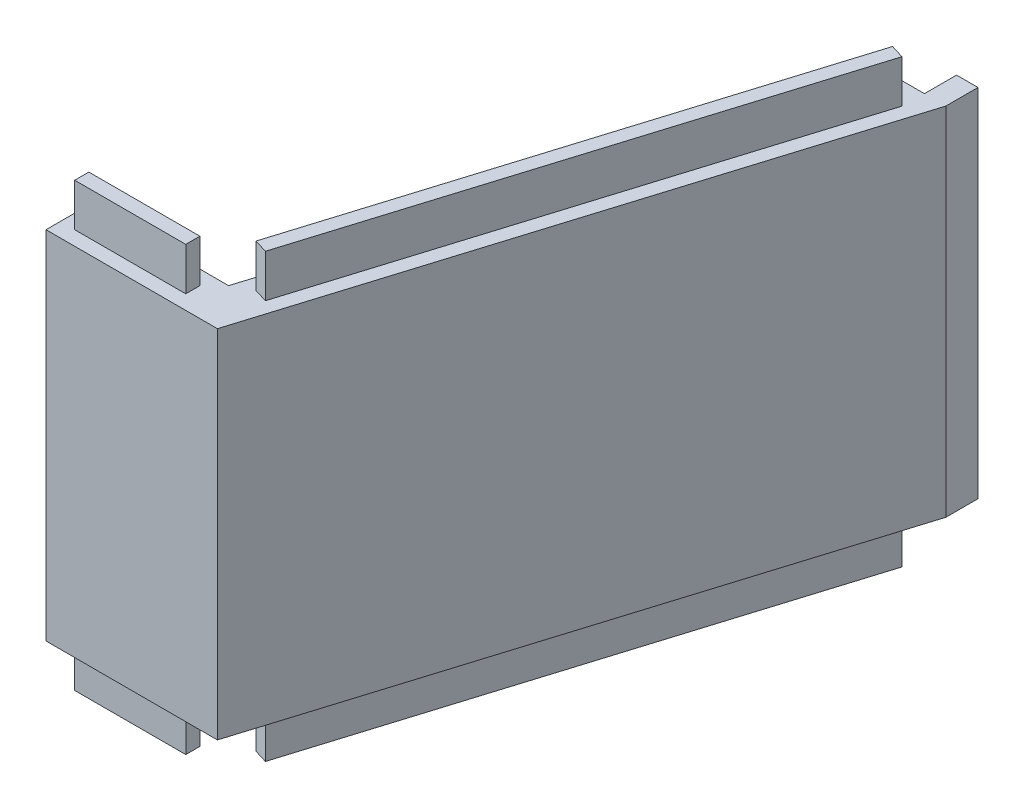
ISO-10303-21;
HEADER;
FILE_DESCRIPTION(('STEP AP214'),'2;1');
FILE_NAME('part.step','',(''),(''),'','','');
FILE_SCHEMA(('AUTOMOTIVE_DESIGN { 1 0 10303 214 1 1 1 1 }'));
ENDSEC;
DATA;
#1=APPLICATION_CONTEXT('core data for automotive mechanical design processes');
#2=APPLICATION_PROTOCOL_DEFINITION('international standard','automotive_design',2000,#1);
#3=PRODUCT_CONTEXT('',#1,'mechanical');
#4=PRODUCT('Part','Part','',(#3));
#5=PRODUCT_RELATED_PRODUCT_CATEGORY('part','',(#4));
#6=PRODUCT_DEFINITION_FORMATION('','',#4);
#7=PRODUCT_DEFINITION_CONTEXT('part definition',#1,'design');
#8=PRODUCT_DEFINITION('design','',#6,#7);
#9=PRODUCT_DEFINITION_SHAPE('','',#8);
#10=(LENGTH_UNIT() NAMED_UNIT(*) SI_UNIT(.MILLI.,.METRE.));
#11=(NAMED_UNIT(*) PLANE_ANGLE_UNIT() SI_UNIT($,.RADIAN.));
#12=(NAMED_UNIT(*) SI_UNIT($,.STERADIAN.) SOLID_ANGLE_UNIT());
#13=UNCERTAINTY_MEASURE_WITH_UNIT(LENGTH_MEASURE(1.E-05),#10,'distance_accuracy_value','');
#14=(GEOMETRIC_REPRESENTATION_CONTEXT(3) GLOBAL_UNCERTAINTY_ASSIGNED_CONTEXT((#13)) GLOBAL_UNIT_ASSIGNED_CONTEXT((#10,
#11,#12)) REPRESENTATION_CONTEXT('',''));
#15=CARTESIAN_POINT('',(0.,0.,0.));
#16=DIRECTION('',(0.,0.,1.));
#17=DIRECTION('',(1.,0.,0.));
#18=AXIS2_PLACEMENT_3D('',#15,#16,#17);
#19=CARTESIAN_POINT('',(0.,0.,0.));
#20=DIRECTION('',(0.,1.,0.));
#21=DIRECTION('',(0.,0.,1.));
#22=AXIS2_PLACEMENT_3D('',#19,#20,#21);
#23=PLANE('',#22);
#24=DIRECTION('',(0.,0.,1.));
#25=VECTOR('',#24,1.);
#26=CARTESIAN_POINT('',(-40.4238403091039,0.,0.));
#27=LINE('',#26,#25);
#28=CARTESIAN_POINT('',(-40.4238403091039,0.,140.920616058493));
#29=VERTEX_POINT('',#28);
#30=CARTESIAN_POINT('',(-40.4238403091039,0.,144.220616058493));
#31=VERTEX_POINT('',#30);
#32=EDGE_CURVE('E264',#29,#31,#27,.T.);
#33=ORIENTED_EDGE('',*,*,#32,.F.);
#34=DIRECTION('',(-1.,0.,0.));
#35=VECTOR('',#34,1.);
#36=CARTESIAN_POINT('',(0.,0.,140.920616058493));
#37=LINE('',#36,#35);
#38=CARTESIAN_POINT('',(-66.3380937639227,0.,140.920616058493));
#39=VERTEX_POINT('',#38);
#40=EDGE_CURVE('E252',#29,#39,#37,.T.);
#41=ORIENTED_EDGE('',*,*,#40,.T.);
#42=DIRECTION('',(0.,0.,1.));
#43=VECTOR('',#42,1.);
#44=CARTESIAN_POINT('',(-66.3380937639227,0.,0.));
#45=LINE('',#44,#43);
#46=CARTESIAN_POINT('',(-66.3380937639227,0.,144.220616058493));
#47=VERTEX_POINT('',#46);
#48=EDGE_CURVE('E272',#39,#47,#45,.T.);
#49=ORIENTED_EDGE('',*,*,#48,.T.);
#50=DIRECTION('',(-1.,0.,0.));
#51=VECTOR('',#50,1.);
#52=CARTESIAN_POINT('',(0.,0.,144.220616058493));
#53=LINE('',#52,#51);
#54=EDGE_CURVE('E268',#31,#47,#53,.T.);
#55=ORIENTED_EDGE('',*,*,#54,.F.);
#56=EDGE_LOOP('',(#33,#41,#49,#55));
#57=FACE_BOUND('',#56,.T.);
#58=DIRECTION('',(-0.294085848837523,0.,0.95577900872195));
#59=VECTOR('',#58,1.);
#60=CARTESIAN_POINT('',(4.80104336650318,0.,1.47724411277021));
#61=LINE('',#60,#59);
#62=CARTESIAN_POINT('',(-0.150763386026933,0.,17.5706160584931));
#63=VERTEX_POINT('',#62);
#64=CARTESIAN_POINT('',(-37.0738403091039,0.,137.570616058493));
#65=VERTEX_POINT('',#64);
#66=EDGE_CURVE('E336',#63,#65,#61,.T.);
#67=ORIENTED_EDGE('',*,*,#66,.F.);
#68=DIRECTION('',(-1.,0.,0.));
#69=VECTOR('',#68,1.);
#70=CARTESIAN_POINT('',(0.,0.,17.5706160584931));
#71=LINE('',#70,#69);
#72=CARTESIAN_POINT('',(5.31190623607724,0.,17.5706160584931));
#73=VERTEX_POINT('',#72);
#74=EDGE_CURVE('E380',#73,#63,#71,.T.);
#75=ORIENTED_EDGE('',*,*,#74,.F.);
#76=DIRECTION('',(0.,0.,1.));
#77=VECTOR('',#76,1.);
#78=CARTESIAN_POINT('',(5.31190623607724,0.,0.));
#79=LINE('',#78,#77);
#80=CARTESIAN_POINT('',(5.31190623607724,0.,10.0706160584931));
#81=VERTEX_POINT('',#80);
#82=EDGE_CURVE('E433',#81,#73,#79,.T.);
#83=ORIENTED_EDGE('',*,*,#82,.F.);
#84=DIRECTION('',(-1.,0.,0.));
#85=VECTOR('',#84,1.);
#86=CARTESIAN_POINT('',(0.,0.,10.0706160584931));
#87=LINE('',#86,#85);
#88=CARTESIAN_POINT('',(10.3119062360772,0.,10.0706160584931));
#89=VERTEX_POINT('',#88);
#90=EDGE_CURVE('E430',#89,#81,#87,.T.);
#91=ORIENTED_EDGE('',*,*,#90,.F.);
#92=DIRECTION('',(0.,0.,1.));
#93=VECTOR('',#92,1.);
#94=CARTESIAN_POINT('',(10.3119062360772,0.,0.));
#95=LINE('',#94,#93);
#96=CARTESIAN_POINT('',(10.3119062360772,0.,17.5706160584931));
#97=VERTEX_POINT('',#96);
#98=EDGE_CURVE('E426',#89,#97,#95,.T.);
#99=ORIENTED_EDGE('',*,*,#98,.T.);
#100=DIRECTION('',(-0.294085848837523,0.,0.95577900872195));
#101=VECTOR('',#100,1.);
#102=CARTESIAN_POINT('',(14.3588334537227,0.,4.41810260114544));
#103=LINE('',#102,#101);
#104=CARTESIAN_POINT('',(-29.6880937639228,0.,147.570616058493));
#105=VERTEX_POINT('',#104);
#106=EDGE_CURVE('E422',#97,#105,#103,.T.);
#107=ORIENTED_EDGE('',*,*,#106,.T.);
#108=DIRECTION('',(1.,0.,0.));
#109=VECTOR('',#108,1.);
#110=CARTESIAN_POINT('',(0.,0.,147.570616058493));
#111=LINE('',#110,#109);
#112=CARTESIAN_POINT('',(-69.6880937639227,0.,147.570616058493));
#113=VERTEX_POINT('',#112);
#114=EDGE_CURVE('E418',#113,#105,#111,.T.);
#115=ORIENTED_EDGE('',*,*,#114,.F.);
#116=DIRECTION('',(0.,0.,1.));
#117=VECTOR('',#116,1.);
#118=CARTESIAN_POINT('',(-69.6880937639227,0.,0.));
#119=LINE('',#118,#117);
#120=CARTESIAN_POINT('',(-69.6880937639227,0.,137.570616058493));
#121=VERTEX_POINT('',#120);
#122=EDGE_CURVE('E415',#121,#113,#119,.T.);
#123=ORIENTED_EDGE('',*,*,#122,.F.);
#124=DIRECTION('',(1.,0.,0.));
#125=VECTOR('',#124,1.);
#126=CARTESIAN_POINT('',(0.,0.,137.570616058493));
#127=LINE('',#126,#125);
#128=EDGE_CURVE('E411',#121,#65,#127,.T.);
#129=ORIENTED_EDGE('',*,*,#128,.T.);
#130=EDGE_LOOP('',(#67,#75,#83,#91,#99,#107,#115,#123,#129));
#131=FACE_BOUND('',#130,.T.);
#132=DIRECTION('',(0.294085848837523,0.,-0.95577900872195));
#133=VECTOR('',#132,1.);
#134=CARTESIAN_POINT('',(8.00290304572171,0.,2.46243170637591));
#135=LINE('',#134,#133);
#136=CARTESIAN_POINT('',(-32.8867930362796,0.,135.35394397288));
#137=VERTEX_POINT('',#136);
#138=CARTESIAN_POINT('',(2.06590869958589,0.,21.7576633313173));
#139=VERTEX_POINT('',#138);
#140=EDGE_CURVE('E62',#137,#139,#135,.T.);
#141=ORIENTED_EDGE('',*,*,#140,.F.);
#142=DIRECTION('',(0.955779008721952,0.,0.294085848837518));
#143=VECTOR('',#142,1.);
#144=CARTESIAN_POINT('',(-40.8896960820007,0.,132.891512266505));
#145=LINE('',#144,#143);
#146=CARTESIAN_POINT('',(-29.7327223074972,0.,136.324427274044));
#147=VERTEX_POINT('',#146);
#148=EDGE_CURVE('E67',#137,#147,#145,.T.);
#149=ORIENTED_EDGE('',*,*,#148,.T.);
#150=DIRECTION('',(0.294085848837523,0.,-0.95577900872195));
#151=VECTOR('',#150,1.);
#152=CARTESIAN_POINT('',(11.1569737745041,0.,3.43291500753974));
#153=LINE('',#152,#151);
#154=CARTESIAN_POINT('',(5.21997942836832,0.,22.7281466324811));
#155=VERTEX_POINT('',#154);
#156=EDGE_CURVE('E824',#147,#155,#153,.T.);
#157=ORIENTED_EDGE('',*,*,#156,.T.);
#158=DIRECTION('',(0.95577900872195,0.,0.294085848837523));
#159=VECTOR('',#158,1.);
#160=CARTESIAN_POINT('',(-5.93699434613581,0.,19.2952316249414));
#161=LINE('',#160,#159);
#162=EDGE_CURVE('E827',#139,#155,#161,.T.);
#163=ORIENTED_EDGE('',*,*,#162,.F.);
#164=EDGE_LOOP('',(#141,#149,#157,#163));
#165=FACE_BOUND('',#164,.T.);
#166=ADVANCED_FACE('F46',(#57,#131,#165),#23,.F.);
#167=CARTESIAN_POINT('',(0.,83.125,0.));
#168=DIRECTION('',(0.,1.,0.));
#169=DIRECTION('',(0.,0.,1.));
#170=AXIS2_PLACEMENT_3D('',#167,#168,#169);
#171=PLANE('',#170);
#172=DIRECTION('',(0.,0.,1.));
#173=VECTOR('',#172,1.);
#174=CARTESIAN_POINT('',(-40.4238403091039,83.125,0.));
#175=LINE('',#174,#173);
#176=CARTESIAN_POINT('',(-40.4238403091039,83.125,140.920616058493));
#177=VERTEX_POINT('',#176);
#178=CARTESIAN_POINT('',(-40.4238403091039,83.125,144.220616058493));
#179=VERTEX_POINT('',#178);
#180=EDGE_CURVE('E237',#177,#179,#175,.T.);
#181=ORIENTED_EDGE('',*,*,#180,.T.);
#182=DIRECTION('',(-1.,0.,0.));
#183=VECTOR('',#182,1.);
#184=CARTESIAN_POINT('',(0.,83.125,144.220616058493));
#185=LINE('',#184,#183);
#186=CARTESIAN_POINT('',(-66.3380937639227,83.125,144.220616058493));
#187=VERTEX_POINT('',#186);
#188=EDGE_CURVE('E342',#179,#187,#185,.T.);
#189=ORIENTED_EDGE('',*,*,#188,.T.);
#190=DIRECTION('',(0.,0.,1.));
#191=VECTOR('',#190,1.);
#192=CARTESIAN_POINT('',(-66.3380937639227,83.125,0.));
#193=LINE('',#192,#191);
#194=CARTESIAN_POINT('',(-66.3380937639227,83.125,140.920616058493));
#195=VERTEX_POINT('',#194);
#196=EDGE_CURVE('E356',#195,#187,#193,.T.);
#197=ORIENTED_EDGE('',*,*,#196,.F.);
#198=DIRECTION('',(-1.,0.,0.));
#199=VECTOR('',#198,1.);
#200=CARTESIAN_POINT('',(0.,83.125,140.920616058493));
#201=LINE('',#200,#199);
#202=EDGE_CURVE('E241',#177,#195,#201,.T.);
#203=ORIENTED_EDGE('',*,*,#202,.F.);
#204=EDGE_LOOP('',(#181,#189,#197,#203));
#205=FACE_BOUND('',#204,.T.);
#206=DIRECTION('',(-0.294085848837523,0.,0.95577900872195));
#207=VECTOR('',#206,1.);
#208=CARTESIAN_POINT('',(4.80104336650318,83.125,1.47724411277021));
#209=LINE('',#208,#207);
#210=CARTESIAN_POINT('',(-0.150763386026933,83.125,17.5706160584931));
#211=VERTEX_POINT('',#210);
#212=CARTESIAN_POINT('',(-37.0738403091039,83.125,137.570616058493));
#213=VERTEX_POINT('',#212);
#214=EDGE_CURVE('E376',#211,#213,#209,.T.);
#215=ORIENTED_EDGE('',*,*,#214,.T.);
#216=DIRECTION('',(1.,0.,0.));
#217=VECTOR('',#216,1.);
#218=CARTESIAN_POINT('',(0.,83.125,137.570616058493));
#219=LINE('',#218,#217);
#220=CARTESIAN_POINT('',(-69.6880937639227,83.125,137.570616058493));
#221=VERTEX_POINT('',#220);
#222=EDGE_CURVE('E379',#221,#213,#219,.T.);
#223=ORIENTED_EDGE('',*,*,#222,.F.);
#224=DIRECTION('',(0.,0.,1.));
#225=VECTOR('',#224,1.);
#226=CARTESIAN_POINT('',(-69.6880937639227,83.125,0.));
#227=LINE('',#226,#225);
#228=CARTESIAN_POINT('',(-69.6880937639227,83.125,147.570616058493));
#229=VERTEX_POINT('',#228);
#230=EDGE_CURVE('E384',#221,#229,#227,.T.);
#231=ORIENTED_EDGE('',*,*,#230,.T.);
#232=DIRECTION('',(1.,0.,0.));
#233=VECTOR('',#232,1.);
#234=CARTESIAN_POINT('',(0.,83.125,147.570616058493));
#235=LINE('',#234,#233);
#236=CARTESIAN_POINT('',(-29.6880937639228,83.125,147.570616058493));
#237=VERTEX_POINT('',#236);
#238=EDGE_CURVE('E387',#229,#237,#235,.T.);
#239=ORIENTED_EDGE('',*,*,#238,.T.);
#240=DIRECTION('',(-0.294085848837523,0.,0.95577900872195));
#241=VECTOR('',#240,1.);
#242=CARTESIAN_POINT('',(14.3588334537227,83.125,4.41810260114544));
#243=LINE('',#242,#241);
#244=CARTESIAN_POINT('',(10.3119062360772,83.125,17.5706160584931));
#245=VERTEX_POINT('',#244);
#246=EDGE_CURVE('E390',#245,#237,#243,.T.);
#247=ORIENTED_EDGE('',*,*,#246,.F.);
#248=DIRECTION('',(0.,0.,1.));
#249=VECTOR('',#248,1.);
#250=CARTESIAN_POINT('',(10.3119062360772,83.125,0.));
#251=LINE('',#250,#249);
#252=CARTESIAN_POINT('',(10.3119062360772,83.125,10.0706160584931));
#253=VERTEX_POINT('',#252);
#254=EDGE_CURVE('E394',#253,#245,#251,.T.);
#255=ORIENTED_EDGE('',*,*,#254,.F.);
#256=DIRECTION('',(-1.,0.,0.));
#257=VECTOR('',#256,1.);
#258=CARTESIAN_POINT('',(0.,83.125,10.0706160584931));
#259=LINE('',#258,#257);
#260=CARTESIAN_POINT('',(5.31190623607724,83.125,10.0706160584931));
#261=VERTEX_POINT('',#260);
#262=EDGE_CURVE('E398',#253,#261,#259,.T.);
#263=ORIENTED_EDGE('',*,*,#262,.T.);
#264=DIRECTION('',(0.,0.,1.));
#265=VECTOR('',#264,1.);
#266=CARTESIAN_POINT('',(5.31190623607724,83.125,0.));
#267=LINE('',#266,#265);
#268=CARTESIAN_POINT('',(5.31190623607724,83.125,17.5706160584931));
#269=VERTEX_POINT('',#268);
#270=EDGE_CURVE('E401',#261,#269,#267,.T.);
#271=ORIENTED_EDGE('',*,*,#270,.T.);
#272=DIRECTION('',(-1.,0.,0.));
#273=VECTOR('',#272,1.);
#274=CARTESIAN_POINT('',(0.,83.125,17.5706160584931));
#275=LINE('',#274,#273);
#276=EDGE_CURVE('E404',#269,#211,#275,.T.);
#277=ORIENTED_EDGE('',*,*,#276,.T.);
#278=EDGE_LOOP('',(#215,#223,#231,#239,#247,#255,#263,#271,#277));
#279=FACE_BOUND('',#278,.T.);
#280=DIRECTION('',(0.955779008721952,0.,0.294085848837518));
#281=VECTOR('',#280,1.);
#282=CARTESIAN_POINT('',(-40.8896960820007,83.125,132.891512266505));
#283=LINE('',#282,#281);
#284=CARTESIAN_POINT('',(-32.8867930362796,83.125,135.35394397288));
#285=VERTEX_POINT('',#284);
#286=CARTESIAN_POINT('',(-29.7327223074972,83.125,136.324427274044));
#287=VERTEX_POINT('',#286);
#288=EDGE_CURVE('E310',#285,#287,#283,.T.);
#289=ORIENTED_EDGE('',*,*,#288,.F.);
#290=DIRECTION('',(0.294085848837523,0.,-0.95577900872195));
#291=VECTOR('',#290,1.);
#292=CARTESIAN_POINT('',(8.00290304572171,83.125,2.46243170637591));
#293=LINE('',#292,#291);
#294=CARTESIAN_POINT('',(2.06590869958589,83.125,21.7576633313173));
#295=VERTEX_POINT('',#294);
#296=EDGE_CURVE('E307',#285,#295,#293,.T.);
#297=ORIENTED_EDGE('',*,*,#296,.T.);
#298=DIRECTION('',(0.95577900872195,0.,0.294085848837523));
#299=VECTOR('',#298,1.);
#300=CARTESIAN_POINT('',(-5.93699434613581,83.125,19.2952316249414));
#301=LINE('',#300,#299);
#302=CARTESIAN_POINT('',(5.21997942836832,83.125,22.7281466324811));
#303=VERTEX_POINT('',#302);
#304=EDGE_CURVE('E296',#295,#303,#301,.T.);
#305=ORIENTED_EDGE('',*,*,#304,.T.);
#306=DIRECTION('',(0.294085848837523,0.,-0.95577900872195));
#307=VECTOR('',#306,1.);
#308=CARTESIAN_POINT('',(11.1569737745041,83.125,3.43291500753974));
#309=LINE('',#308,#307);
#310=EDGE_CURVE('E315',#287,#303,#309,.T.);
#311=ORIENTED_EDGE('',*,*,#310,.F.);
#312=EDGE_LOOP('',(#289,#297,#305,#311));
#313=FACE_BOUND('',#312,.T.);
#314=ADVANCED_FACE('F505',(#205,#279,#313),#171,.T.);
#315=CARTESIAN_POINT('',(4.80104336650318,83.125,1.47724411277021));
#316=DIRECTION('',(0.95577900872195,0.,0.294085848837523));
#317=DIRECTION('',(0.294085848837523,0.,-0.95577900872195));
#318=AXIS2_PLACEMENT_3D('',#315,#316,#317);
#319=PLANE('',#318);
#320=ORIENTED_EDGE('',*,*,#66,.T.);
#321=DIRECTION('',(0.,-1.,0.));
#322=VECTOR('',#321,1.);
#323=CARTESIAN_POINT('',(-37.0738403091039,83.125,137.570616058493));
#324=LINE('',#323,#322);
#325=EDGE_CURVE('E11',#213,#65,#324,.T.);
#326=ORIENTED_EDGE('',*,*,#325,.F.);
#327=ORIENTED_EDGE('',*,*,#214,.F.);
#328=DIRECTION('',(0.,-1.,0.));
#329=VECTOR('',#328,1.);
#330=CARTESIAN_POINT('',(-0.150763386026933,83.125,17.5706160584931));
#331=LINE('',#330,#329);
#332=EDGE_CURVE('E407',#211,#63,#331,.T.);
#333=ORIENTED_EDGE('',*,*,#332,.T.);
#334=EDGE_LOOP('',(#320,#326,#327,#333));
#335=FACE_BOUND('',#334,.T.);
#336=ADVANCED_FACE('F48',(#335),#319,.F.);
#337=CARTESIAN_POINT('',(0.,83.125,137.570616058493));
#338=DIRECTION('',(0.,0.,-1.));
#339=DIRECTION('',(-1.,0.,0.));
#340=AXIS2_PLACEMENT_3D('',#337,#338,#339);
#341=PLANE('',#340);
#342=ORIENTED_EDGE('',*,*,#128,.F.);
#343=DIRECTION('',(0.,-1.,0.));
#344=VECTOR('',#343,1.);
#345=CARTESIAN_POINT('',(-69.6880937639227,83.125,137.570616058493));
#346=LINE('',#345,#344);
#347=EDGE_CURVE('E55',#221,#121,#346,.T.);
#348=ORIENTED_EDGE('',*,*,#347,.F.);
#349=ORIENTED_EDGE('',*,*,#222,.T.);
#350=ORIENTED_EDGE('',*,*,#325,.T.);
#351=EDGE_LOOP('',(#342,#348,#349,#350));
#352=FACE_BOUND('',#351,.T.);
#353=ADVANCED_FACE('F473',(#352),#341,.T.);
#354=CARTESIAN_POINT('',(-69.6880937639227,83.125,0.));
#355=DIRECTION('',(1.,0.,0.));
#356=DIRECTION('',(0.,0.,-1.));
#357=AXIS2_PLACEMENT_3D('',#354,#355,#356);
#358=PLANE('',#357);
#359=ORIENTED_EDGE('',*,*,#122,.T.);
#360=DIRECTION('',(0.,-1.,0.));
#361=VECTOR('',#360,1.);
#362=CARTESIAN_POINT('',(-69.6880937639227,83.125,147.570616058493));
#363=LINE('',#362,#361);
#364=EDGE_CURVE('E458',#229,#113,#363,.T.);
#365=ORIENTED_EDGE('',*,*,#364,.F.);
#366=ORIENTED_EDGE('',*,*,#230,.F.);
#367=ORIENTED_EDGE('',*,*,#347,.T.);
#368=EDGE_LOOP('',(#359,#365,#366,#367));
#369=FACE_BOUND('',#368,.T.);
#370=ADVANCED_FACE('F465',(#369),#358,.F.);
#371=CARTESIAN_POINT('',(0.,83.125,147.570616058493));
#372=DIRECTION('',(0.,0.,-1.));
#373=DIRECTION('',(-1.,0.,0.));
#374=AXIS2_PLACEMENT_3D('',#371,#372,#373);
#375=PLANE('',#374);
#376=ORIENTED_EDGE('',*,*,#114,.T.);
#377=DIRECTION('',(0.,-1.,0.));
#378=VECTOR('',#377,1.);
#379=CARTESIAN_POINT('',(-29.6880937639228,83.125,147.570616058493));
#380=LINE('',#379,#378);
#381=EDGE_CURVE('E455',#237,#105,#380,.T.);
#382=ORIENTED_EDGE('',*,*,#381,.F.);
#383=ORIENTED_EDGE('',*,*,#238,.F.);
#384=ORIENTED_EDGE('',*,*,#364,.T.);
#385=EDGE_LOOP('',(#376,#382,#383,#384));
#386=FACE_BOUND('',#385,.T.);
#387=ADVANCED_FACE('F503',(#386),#375,.F.);
#388=CARTESIAN_POINT('',(14.3588334537227,83.125,4.41810260114544));
#389=DIRECTION('',(0.95577900872195,0.,0.294085848837523));
#390=DIRECTION('',(0.294085848837523,0.,-0.95577900872195));
#391=AXIS2_PLACEMENT_3D('',#388,#389,#390);
#392=PLANE('',#391);
#393=ORIENTED_EDGE('',*,*,#106,.F.);
#394=DIRECTION('',(0.,-1.,0.));
#395=VECTOR('',#394,1.);
#396=CARTESIAN_POINT('',(10.3119062360772,83.125,17.5706160584931));
#397=LINE('',#396,#395);
#398=EDGE_CURVE('E452',#245,#97,#397,.T.);
#399=ORIENTED_EDGE('',*,*,#398,.F.);
#400=ORIENTED_EDGE('',*,*,#246,.T.);
#401=ORIENTED_EDGE('',*,*,#381,.T.);
#402=EDGE_LOOP('',(#393,#399,#400,#401));
#403=FACE_BOUND('',#402,.T.);
#404=ADVANCED_FACE('F499',(#403),#392,.T.);
#405=CARTESIAN_POINT('',(10.3119062360772,83.125,0.));
#406=DIRECTION('',(1.,0.,0.));
#407=DIRECTION('',(0.,0.,-1.));
#408=AXIS2_PLACEMENT_3D('',#405,#406,#407);
#409=PLANE('',#408);
#410=ORIENTED_EDGE('',*,*,#98,.F.);
#411=DIRECTION('',(0.,-1.,0.));
#412=VECTOR('',#411,1.);
#413=CARTESIAN_POINT('',(10.3119062360772,83.125,10.0706160584931));
#414=LINE('',#413,#412);
#415=EDGE_CURVE('E449',#253,#89,#414,.T.);
#416=ORIENTED_EDGE('',*,*,#415,.F.);
#417=ORIENTED_EDGE('',*,*,#254,.T.);
#418=ORIENTED_EDGE('',*,*,#398,.T.);
#419=EDGE_LOOP('',(#410,#416,#417,#418));
#420=FACE_BOUND('',#419,.T.);
#421=ADVANCED_FACE('F495',(#420),#409,.T.);
#422=CARTESIAN_POINT('',(0.,83.125,10.0706160584931));
#423=DIRECTION('',(0.,0.,1.));
#424=DIRECTION('',(1.,0.,0.));
#425=AXIS2_PLACEMENT_3D('',#422,#423,#424);
#426=PLANE('',#425);
#427=ORIENTED_EDGE('',*,*,#90,.T.);
#428=DIRECTION('',(0.,-1.,0.));
#429=VECTOR('',#428,1.);
#430=CARTESIAN_POINT('',(5.31190623607724,83.125,10.0706160584931));
#431=LINE('',#430,#429);
#432=EDGE_CURVE('E445',#261,#81,#431,.T.);
#433=ORIENTED_EDGE('',*,*,#432,.F.);
#434=ORIENTED_EDGE('',*,*,#262,.F.);
#435=ORIENTED_EDGE('',*,*,#415,.T.);
#436=EDGE_LOOP('',(#427,#433,#434,#435));
#437=FACE_BOUND('',#436,.T.);
#438=ADVANCED_FACE('F491',(#437),#426,.F.);
#439=CARTESIAN_POINT('',(5.31190623607724,83.125,0.));
#440=DIRECTION('',(1.,0.,0.));
#441=DIRECTION('',(0.,0.,-1.));
#442=AXIS2_PLACEMENT_3D('',#439,#440,#441);
#443=PLANE('',#442);
#444=ORIENTED_EDGE('',*,*,#82,.T.);
#445=DIRECTION('',(0.,-1.,0.));
#446=VECTOR('',#445,1.);
#447=CARTESIAN_POINT('',(5.31190623607724,83.125,17.5706160584931));
#448=LINE('',#447,#446);
#449=EDGE_CURVE('E441',#269,#73,#448,.T.);
#450=ORIENTED_EDGE('',*,*,#449,.F.);
#451=ORIENTED_EDGE('',*,*,#270,.F.);
#452=ORIENTED_EDGE('',*,*,#432,.T.);
#453=EDGE_LOOP('',(#444,#450,#451,#452));
#454=FACE_BOUND('',#453,.T.);
#455=ADVANCED_FACE('F487',(#454),#443,.F.);
#456=CARTESIAN_POINT('',(0.,83.125,17.5706160584931));
#457=DIRECTION('',(0.,0.,1.));
#458=DIRECTION('',(1.,0.,0.));
#459=AXIS2_PLACEMENT_3D('',#456,#457,#458);
#460=PLANE('',#459);
#461=ORIENTED_EDGE('',*,*,#74,.T.);
#462=ORIENTED_EDGE('',*,*,#332,.F.);
#463=ORIENTED_EDGE('',*,*,#276,.F.);
#464=ORIENTED_EDGE('',*,*,#449,.T.);
#465=EDGE_LOOP('',(#461,#462,#463,#464));
#466=FACE_BOUND('',#465,.T.);
#467=ADVANCED_FACE('F482',(#466),#460,.F.);
#468=CARTESIAN_POINT('',(-40.4238403091039,93.125,0.));
#469=DIRECTION('',(1.,0.,0.));
#470=DIRECTION('',(0.,0.,-1.));
#471=AXIS2_PLACEMENT_3D('',#468,#469,#470);
#472=PLANE('',#471);
#473=ORIENTED_EDGE('',*,*,#180,.F.);
#474=DIRECTION('',(0.,-1.,0.));
#475=VECTOR('',#474,1.);
#476=CARTESIAN_POINT('',(-40.4238403091039,93.125,140.920616058493));
#477=LINE('',#476,#475);
#478=CARTESIAN_POINT('',(-40.4238403091039,93.125,140.920616058493));
#479=VERTEX_POINT('',#478);
#480=EDGE_CURVE('E311',#479,#177,#477,.T.);
#481=ORIENTED_EDGE('',*,*,#480,.F.);
#482=DIRECTION('',(0.,0.,1.));
#483=VECTOR('',#482,1.);
#484=CARTESIAN_POINT('',(-40.4238403091039,93.125,0.));
#485=LINE('',#484,#483);
#486=CARTESIAN_POINT('',(-40.4238403091039,93.125,144.220616058493));
#487=VERTEX_POINT('',#486);
#488=EDGE_CURVE('E337',#479,#487,#485,.T.);
#489=ORIENTED_EDGE('',*,*,#488,.T.);
#490=DIRECTION('',(0.,-1.,0.));
#491=VECTOR('',#490,1.);
#492=CARTESIAN_POINT('',(-40.4238403091039,93.125,144.220616058493));
#493=LINE('',#492,#491);
#494=EDGE_CURVE('E351',#487,#179,#493,.T.);
#495=ORIENTED_EDGE('',*,*,#494,.T.);
#496=EDGE_LOOP('',(#473,#481,#489,#495));
#497=FACE_BOUND('',#496,.T.);
#498=ADVANCED_FACE('F549',(#497),#472,.T.);
#499=CARTESIAN_POINT('',(0.,93.125,140.920616058493));
#500=DIRECTION('',(0.,0.,1.));
#501=DIRECTION('',(1.,0.,0.));
#502=AXIS2_PLACEMENT_3D('',#499,#500,#501);
#503=PLANE('',#502);
#504=ORIENTED_EDGE('',*,*,#202,.T.);
#505=DIRECTION('',(0.,-1.,0.));
#506=VECTOR('',#505,1.);
#507=CARTESIAN_POINT('',(-66.3380937639227,93.125,140.920616058493));
#508=LINE('',#507,#506);
#509=CARTESIAN_POINT('',(-66.3380937639227,93.125,140.920616058493));
#510=VERTEX_POINT('',#509);
#511=EDGE_CURVE('E369',#510,#195,#508,.T.);
#512=ORIENTED_EDGE('',*,*,#511,.F.);
#513=DIRECTION('',(-1.,0.,0.));
#514=VECTOR('',#513,1.);
#515=CARTESIAN_POINT('',(0.,93.125,140.920616058493));
#516=LINE('',#515,#514);
#517=EDGE_CURVE('E341',#479,#510,#516,.T.);
#518=ORIENTED_EDGE('',*,*,#517,.F.);
#519=ORIENTED_EDGE('',*,*,#480,.T.);
#520=EDGE_LOOP('',(#504,#512,#518,#519));
#521=FACE_BOUND('',#520,.T.);
#522=ADVANCED_FACE('F643',(#521),#503,.F.);
#523=CARTESIAN_POINT('',(-66.3380937639227,93.125,0.));
#524=DIRECTION('',(1.,0.,0.));
#525=DIRECTION('',(0.,0.,-1.));
#526=AXIS2_PLACEMENT_3D('',#523,#524,#525);
#527=PLANE('',#526);
#528=ORIENTED_EDGE('',*,*,#196,.T.);
#529=DIRECTION('',(0.,-1.,0.));
#530=VECTOR('',#529,1.);
#531=CARTESIAN_POINT('',(-66.3380937639227,93.125,144.220616058493));
#532=LINE('',#531,#530);
#533=CARTESIAN_POINT('',(-66.3380937639227,93.125,144.220616058493));
#534=VERTEX_POINT('',#533);
#535=EDGE_CURVE('E365',#534,#187,#532,.T.);
#536=ORIENTED_EDGE('',*,*,#535,.F.);
#537=DIRECTION('',(0.,0.,1.));
#538=VECTOR('',#537,1.);
#539=CARTESIAN_POINT('',(-66.3380937639227,93.125,0.));
#540=LINE('',#539,#538);
#541=EDGE_CURVE('E345',#510,#534,#540,.T.);
#542=ORIENTED_EDGE('',*,*,#541,.F.);
#543=ORIENTED_EDGE('',*,*,#511,.T.);
#544=EDGE_LOOP('',(#528,#536,#542,#543));
#545=FACE_BOUND('',#544,.T.);
#546=ADVANCED_FACE('F652',(#545),#527,.F.);
#547=CARTESIAN_POINT('',(0.,93.125,144.220616058493));
#548=DIRECTION('',(0.,0.,1.));
#549=DIRECTION('',(1.,0.,0.));
#550=AXIS2_PLACEMENT_3D('',#547,#548,#549);
#551=PLANE('',#550);
#552=ORIENTED_EDGE('',*,*,#188,.F.);
#553=ORIENTED_EDGE('',*,*,#494,.F.);
#554=DIRECTION('',(-1.,0.,0.));
#555=VECTOR('',#554,1.);
#556=CARTESIAN_POINT('',(0.,93.125,144.220616058493));
#557=LINE('',#556,#555);
#558=EDGE_CURVE('E348',#487,#534,#557,.T.);
#559=ORIENTED_EDGE('',*,*,#558,.T.);
#560=ORIENTED_EDGE('',*,*,#535,.T.);
#561=EDGE_LOOP('',(#552,#553,#559,#560));
#562=FACE_BOUND('',#561,.T.);
#563=ADVANCED_FACE('F662',(#562),#551,.T.);
#564=CARTESIAN_POINT('',(0.,93.125,0.));
#565=DIRECTION('',(0.,1.,0.));
#566=DIRECTION('',(0.,0.,1.));
#567=AXIS2_PLACEMENT_3D('',#564,#565,#566);
#568=PLANE('',#567);
#569=ORIENTED_EDGE('',*,*,#488,.F.);
#570=ORIENTED_EDGE('',*,*,#517,.T.);
#571=ORIENTED_EDGE('',*,*,#541,.T.);
#572=ORIENTED_EDGE('',*,*,#558,.F.);
#573=EDGE_LOOP('',(#569,#570,#571,#572));
#574=FACE_BOUND('',#573,.T.);
#575=ADVANCED_FACE('F672',(#574),#568,.T.);
#576=CARTESIAN_POINT('',(8.00290304572171,93.125,2.46243170637591));
#577=DIRECTION('',(-0.95577900872195,0.,-0.294085848837523));
#578=DIRECTION('',(-0.294085848837523,0.,0.95577900872195));
#579=AXIS2_PLACEMENT_3D('',#576,#577,#578);
#580=PLANE('',#579);
#581=ORIENTED_EDGE('',*,*,#296,.F.);
#582=DIRECTION('',(0.,-1.,0.));
#583=VECTOR('',#582,1.);
#584=CARTESIAN_POINT('',(-32.8867930362796,93.125,135.35394397288));
#585=LINE('',#584,#583);
#586=CARTESIAN_POINT('',(-32.8867930362796,93.125,135.35394397288));
#587=VERTEX_POINT('',#586);
#588=EDGE_CURVE('E332',#587,#285,#585,.T.);
#589=ORIENTED_EDGE('',*,*,#588,.F.);
#590=DIRECTION('',(0.294085848837523,0.,-0.95577900872195));
#591=VECTOR('',#590,1.);
#592=CARTESIAN_POINT('',(8.00290304572171,93.125,2.46243170637591));
#593=LINE('',#592,#591);
#594=CARTESIAN_POINT('',(2.06590869958589,93.125,21.7576633313173));
#595=VERTEX_POINT('',#594);
#596=EDGE_CURVE('E291',#587,#595,#593,.T.);
#597=ORIENTED_EDGE('',*,*,#596,.T.);
#598=DIRECTION('',(0.,-1.,0.));
#599=VECTOR('',#598,1.);
#600=CARTESIAN_POINT('',(2.06590869958589,93.125,21.7576633313173));
#601=LINE('',#600,#599);
#602=EDGE_CURVE('E306',#595,#295,#601,.T.);
#603=ORIENTED_EDGE('',*,*,#602,.T.);
#604=EDGE_LOOP('',(#581,#589,#597,#603));
#605=FACE_BOUND('',#604,.T.);
#606=ADVANCED_FACE('F517',(#605),#580,.T.);
#607=CARTESIAN_POINT('',(-40.8896960820007,93.125,132.891512266505));
#608=DIRECTION('',(0.294085848837518,0.,-0.955779008721952));
#609=DIRECTION('',(-0.955779008721952,0.,-0.294085848837518));
#610=AXIS2_PLACEMENT_3D('',#607,#608,#609);
#611=PLANE('',#610);
#612=ORIENTED_EDGE('',*,*,#288,.T.);
#613=DIRECTION('',(0.,-1.,0.));
#614=VECTOR('',#613,1.);
#615=CARTESIAN_POINT('',(-29.7327223074972,93.125,136.324427274044));
#616=LINE('',#615,#614);
#617=CARTESIAN_POINT('',(-29.7327223074972,93.125,136.324427274044));
#618=VERTEX_POINT('',#617);
#619=EDGE_CURVE('E328',#618,#287,#616,.T.);
#620=ORIENTED_EDGE('',*,*,#619,.F.);
#621=DIRECTION('',(0.955779008721952,0.,0.294085848837518));
#622=VECTOR('',#621,1.);
#623=CARTESIAN_POINT('',(-40.8896960820007,93.125,132.891512266505));
#624=LINE('',#623,#622);
#625=EDGE_CURVE('E295',#587,#618,#624,.T.);
#626=ORIENTED_EDGE('',*,*,#625,.F.);
#627=ORIENTED_EDGE('',*,*,#588,.T.);
#628=EDGE_LOOP('',(#612,#620,#626,#627));
#629=FACE_BOUND('',#628,.T.);
#630=ADVANCED_FACE('F514',(#629),#611,.F.);
#631=CARTESIAN_POINT('',(11.1569737745041,93.125,3.43291500753974));
#632=DIRECTION('',(-0.95577900872195,0.,-0.294085848837523));
#633=DIRECTION('',(-0.294085848837523,0.,0.95577900872195));
#634=AXIS2_PLACEMENT_3D('',#631,#632,#633);
#635=PLANE('',#634);
#636=ORIENTED_EDGE('',*,*,#310,.T.);
#637=DIRECTION('',(0.,-1.,0.));
#638=VECTOR('',#637,1.);
#639=CARTESIAN_POINT('',(5.21997942836832,93.125,22.7281466324811));
#640=LINE('',#639,#638);
#641=CARTESIAN_POINT('',(5.21997942836832,93.125,22.7281466324811));
#642=VERTEX_POINT('',#641);
#643=EDGE_CURVE('E324',#642,#303,#640,.T.);
#644=ORIENTED_EDGE('',*,*,#643,.F.);
#645=DIRECTION('',(0.294085848837523,0.,-0.95577900872195));
#646=VECTOR('',#645,1.);
#647=CARTESIAN_POINT('',(11.1569737745041,93.125,3.43291500753974));
#648=LINE('',#647,#646);
#649=EDGE_CURVE('E299',#618,#642,#648,.T.);
#650=ORIENTED_EDGE('',*,*,#649,.F.);
#651=ORIENTED_EDGE('',*,*,#619,.T.);
#652=EDGE_LOOP('',(#636,#644,#650,#651));
#653=FACE_BOUND('',#652,.T.);
#654=ADVANCED_FACE('F525',(#653),#635,.F.);
#655=CARTESIAN_POINT('',(-5.93699434613581,93.125,19.2952316249414));
#656=DIRECTION('',(0.294085848837523,0.,-0.95577900872195));
#657=DIRECTION('',(-0.95577900872195,0.,-0.294085848837523));
#658=AXIS2_PLACEMENT_3D('',#655,#656,#657);
#659=PLANE('',#658);
#660=ORIENTED_EDGE('',*,*,#304,.F.);
#661=ORIENTED_EDGE('',*,*,#602,.F.);
#662=DIRECTION('',(0.95577900872195,0.,0.294085848837523));
#663=VECTOR('',#662,1.);
#664=CARTESIAN_POINT('',(-5.93699434613581,93.125,19.2952316249414));
#665=LINE('',#664,#663);
#666=EDGE_CURVE('E302',#595,#642,#665,.T.);
#667=ORIENTED_EDGE('',*,*,#666,.T.);
#668=ORIENTED_EDGE('',*,*,#643,.T.);
#669=EDGE_LOOP('',(#660,#661,#667,#668));
#670=FACE_BOUND('',#669,.T.);
#671=ADVANCED_FACE('F521',(#670),#659,.T.);
#672=CARTESIAN_POINT('',(0.,93.125,0.));
#673=DIRECTION('',(0.,1.,0.));
#674=DIRECTION('',(0.,0.,1.));
#675=AXIS2_PLACEMENT_3D('',#672,#673,#674);
#676=PLANE('',#675);
#677=ORIENTED_EDGE('',*,*,#596,.F.);
#678=ORIENTED_EDGE('',*,*,#625,.T.);
#679=ORIENTED_EDGE('',*,*,#649,.T.);
#680=ORIENTED_EDGE('',*,*,#666,.F.);
#681=EDGE_LOOP('',(#677,#678,#679,#680));
#682=FACE_BOUND('',#681,.T.);
#683=ADVANCED_FACE('F527',(#682),#676,.T.);
#684=CARTESIAN_POINT('',(-40.4238403091039,-10.,0.));
#685=DIRECTION('',(-1.,0.,0.));
#686=DIRECTION('',(0.,0.,1.));
#687=AXIS2_PLACEMENT_3D('',#684,#685,#686);
#688=PLANE('',#687);
#689=ORIENTED_EDGE('',*,*,#32,.T.);
#690=DIRECTION('',(0.,1.,0.));
#691=VECTOR('',#690,1.);
#692=CARTESIAN_POINT('',(-40.4238403091039,-10.,144.220616058493));
#693=LINE('',#692,#691);
#694=CARTESIAN_POINT('',(-40.4238403091039,-10.,144.220616058493));
#695=VERTEX_POINT('',#694);
#696=EDGE_CURVE('E288',#695,#31,#693,.T.);
#697=ORIENTED_EDGE('',*,*,#696,.F.);
#698=DIRECTION('',(0.,0.,1.));
#699=VECTOR('',#698,1.);
#700=CARTESIAN_POINT('',(-40.4238403091039,-10.,0.));
#701=LINE('',#700,#699);
#702=CARTESIAN_POINT('',(-40.4238403091039,-10.,140.920616058493));
#703=VERTEX_POINT('',#702);
#704=EDGE_CURVE('E247',#703,#695,#701,.T.);
#705=ORIENTED_EDGE('',*,*,#704,.F.);
#706=DIRECTION('',(0.,1.,0.));
#707=VECTOR('',#706,1.);
#708=CARTESIAN_POINT('',(-40.4238403091039,-10.,140.920616058493));
#709=LINE('',#708,#707);
#710=EDGE_CURVE('E263',#703,#29,#709,.T.);
#711=ORIENTED_EDGE('',*,*,#710,.T.);
#712=EDGE_LOOP('',(#689,#697,#705,#711));
#713=FACE_BOUND('',#712,.T.);
#714=ADVANCED_FACE('F529',(#713),#688,.F.);
#715=CARTESIAN_POINT('',(0.,-10.,144.220616058493));
#716=DIRECTION('',(0.,0.,-1.));
#717=DIRECTION('',(-1.,0.,0.));
#718=AXIS2_PLACEMENT_3D('',#715,#716,#717);
#719=PLANE('',#718);
#720=ORIENTED_EDGE('',*,*,#54,.T.);
#721=DIRECTION('',(0.,1.,0.));
#722=VECTOR('',#721,1.);
#723=CARTESIAN_POINT('',(-66.3380937639227,-10.,144.220616058493));
#724=LINE('',#723,#722);
#725=CARTESIAN_POINT('',(-66.3380937639227,-10.,144.220616058493));
#726=VERTEX_POINT('',#725);
#727=EDGE_CURVE('E285',#726,#47,#724,.T.);
#728=ORIENTED_EDGE('',*,*,#727,.F.);
#729=DIRECTION('',(-1.,0.,0.));
#730=VECTOR('',#729,1.);
#731=CARTESIAN_POINT('',(0.,-10.,144.220616058493));
#732=LINE('',#731,#730);
#733=EDGE_CURVE('E251',#695,#726,#732,.T.);
#734=ORIENTED_EDGE('',*,*,#733,.F.);
#735=ORIENTED_EDGE('',*,*,#696,.T.);
#736=EDGE_LOOP('',(#720,#728,#734,#735));
#737=FACE_BOUND('',#736,.T.);
#738=ADVANCED_FACE('F536',(#737),#719,.F.);
#739=CARTESIAN_POINT('',(-66.3380937639227,-10.,0.));
#740=DIRECTION('',(-1.,0.,0.));
#741=DIRECTION('',(0.,0.,1.));
#742=AXIS2_PLACEMENT_3D('',#739,#740,#741);
#743=PLANE('',#742);
#744=ORIENTED_EDGE('',*,*,#48,.F.);
#745=DIRECTION('',(0.,1.,0.));
#746=VECTOR('',#745,1.);
#747=CARTESIAN_POINT('',(-66.3380937639227,-10.,140.920616058493));
#748=LINE('',#747,#746);
#749=CARTESIAN_POINT('',(-66.3380937639227,-10.,140.920616058493));
#750=VERTEX_POINT('',#749);
#751=EDGE_CURVE('E281',#750,#39,#748,.T.);
#752=ORIENTED_EDGE('',*,*,#751,.F.);
#753=DIRECTION('',(0.,0.,1.));
#754=VECTOR('',#753,1.);
#755=CARTESIAN_POINT('',(-66.3380937639227,-10.,0.));
#756=LINE('',#755,#754);
#757=EDGE_CURVE('E255',#750,#726,#756,.T.);
#758=ORIENTED_EDGE('',*,*,#757,.T.);
#759=ORIENTED_EDGE('',*,*,#727,.T.);
#760=EDGE_LOOP('',(#744,#752,#758,#759));
#761=FACE_BOUND('',#760,.T.);
#762=ADVANCED_FACE('F744',(#761),#743,.T.);
#763=CARTESIAN_POINT('',(0.,-10.,140.920616058493));
#764=DIRECTION('',(0.,0.,-1.));
#765=DIRECTION('',(-1.,0.,0.));
#766=AXIS2_PLACEMENT_3D('',#763,#764,#765);
#767=PLANE('',#766);
#768=ORIENTED_EDGE('',*,*,#40,.F.);
#769=ORIENTED_EDGE('',*,*,#710,.F.);
#770=DIRECTION('',(-1.,0.,0.));
#771=VECTOR('',#770,1.);
#772=CARTESIAN_POINT('',(0.,-10.,140.920616058493));
#773=LINE('',#772,#771);
#774=EDGE_CURVE('E259',#703,#750,#773,.T.);
#775=ORIENTED_EDGE('',*,*,#774,.T.);
#776=ORIENTED_EDGE('',*,*,#751,.T.);
#777=EDGE_LOOP('',(#768,#769,#775,#776));
#778=FACE_BOUND('',#777,.T.);
#779=ADVANCED_FACE('F754',(#778),#767,.T.);
#780=CARTESIAN_POINT('',(0.,-10.,0.));
#781=DIRECTION('',(0.,-1.,0.));
#782=DIRECTION('',(0.,0.,1.));
#783=AXIS2_PLACEMENT_3D('',#780,#781,#782);
#784=PLANE('',#783);
#785=ORIENTED_EDGE('',*,*,#704,.T.);
#786=ORIENTED_EDGE('',*,*,#733,.T.);
#787=ORIENTED_EDGE('',*,*,#757,.F.);
#788=ORIENTED_EDGE('',*,*,#774,.F.);
#789=EDGE_LOOP('',(#785,#786,#787,#788));
#790=FACE_BOUND('',#789,.T.);
#791=ADVANCED_FACE('F764',(#790),#784,.T.);
#792=CARTESIAN_POINT('',(8.00290304572171,-10.,2.46243170637591));
#793=DIRECTION('',(0.95577900872195,0.,0.294085848837523));
#794=DIRECTION('',(0.294085848837523,0.,-0.95577900872195));
#795=AXIS2_PLACEMENT_3D('',#792,#793,#794);
#796=PLANE('',#795);
#797=ORIENTED_EDGE('',*,*,#140,.T.);
#798=DIRECTION('',(0.,1.,0.));
#799=VECTOR('',#798,1.);
#800=CARTESIAN_POINT('',(2.06590869958589,-10.,21.7576633313173));
#801=LINE('',#800,#799);
#802=CARTESIAN_POINT('',(2.06590869958589,-10.,21.7576633313173));
#803=VERTEX_POINT('',#802);
#804=EDGE_CURVE('E217',#803,#139,#801,.T.);
#805=ORIENTED_EDGE('',*,*,#804,.F.);
#806=DIRECTION('',(0.294085848837523,0.,-0.95577900872195));
#807=VECTOR('',#806,1.);
#808=CARTESIAN_POINT('',(8.00290304572171,-10.,2.46243170637591));
#809=LINE('',#808,#807);
#810=CARTESIAN_POINT('',(-32.8867930362796,-10.,135.35394397288));
#811=VERTEX_POINT('',#810);
#812=EDGE_CURVE('E225',#811,#803,#809,.T.);
#813=ORIENTED_EDGE('',*,*,#812,.F.);
#814=DIRECTION('',(0.,1.,0.));
#815=VECTOR('',#814,1.);
#816=CARTESIAN_POINT('',(-32.8867930362796,-10.,135.35394397288));
#817=LINE('',#816,#815);
#818=EDGE_CURVE('E821',#811,#137,#817,.T.);
#819=ORIENTED_EDGE('',*,*,#818,.T.);
#820=EDGE_LOOP('',(#797,#805,#813,#819));
#821=FACE_BOUND('',#820,.T.);
#822=ADVANCED_FACE('F235',(#821),#796,.F.);
#823=CARTESIAN_POINT('',(-5.93699434613581,-10.,19.2952316249414));
#824=DIRECTION('',(-0.294085848837523,0.,0.95577900872195));
#825=DIRECTION('',(0.95577900872195,0.,0.294085848837523));
#826=AXIS2_PLACEMENT_3D('',#823,#824,#825);
#827=PLANE('',#826);
#828=ORIENTED_EDGE('',*,*,#162,.T.);
#829=DIRECTION('',(0.,1.,0.));
#830=VECTOR('',#829,1.);
#831=CARTESIAN_POINT('',(5.21997942836832,-10.,22.7281466324811));
#832=LINE('',#831,#830);
#833=CARTESIAN_POINT('',(5.21997942836832,-10.,22.7281466324811));
#834=VERTEX_POINT('',#833);
#835=EDGE_CURVE('E219',#834,#155,#832,.T.);
#836=ORIENTED_EDGE('',*,*,#835,.F.);
#837=DIRECTION('',(0.95577900872195,0.,0.294085848837523));
#838=VECTOR('',#837,1.);
#839=CARTESIAN_POINT('',(-5.93699434613581,-10.,19.2952316249414));
#840=LINE('',#839,#838);
#841=EDGE_CURVE('E212',#803,#834,#840,.T.);
#842=ORIENTED_EDGE('',*,*,#841,.F.);
#843=ORIENTED_EDGE('',*,*,#804,.T.);
#844=EDGE_LOOP('',(#828,#836,#842,#843));
#845=FACE_BOUND('',#844,.T.);
#846=ADVANCED_FACE('F215',(#845),#827,.F.);
#847=CARTESIAN_POINT('',(11.1569737745041,-10.,3.43291500753974));
#848=DIRECTION('',(0.95577900872195,0.,0.294085848837523));
#849=DIRECTION('',(0.294085848837523,0.,-0.95577900872195));
#850=AXIS2_PLACEMENT_3D('',#847,#848,#849);
#851=PLANE('',#850);
#852=ORIENTED_EDGE('',*,*,#156,.F.);
#853=DIRECTION('',(0.,1.,0.));
#854=VECTOR('',#853,1.);
#855=CARTESIAN_POINT('',(-29.7327223074972,-10.,136.324427274044));
#856=LINE('',#855,#854);
#857=CARTESIAN_POINT('',(-29.7327223074972,-10.,136.324427274044));
#858=VERTEX_POINT('',#857);
#859=EDGE_CURVE('E243',#858,#147,#856,.T.);
#860=ORIENTED_EDGE('',*,*,#859,.F.);
#861=DIRECTION('',(0.294085848837523,0.,-0.95577900872195));
#862=VECTOR('',#861,1.);
#863=CARTESIAN_POINT('',(11.1569737745041,-10.,3.43291500753974));
#864=LINE('',#863,#862);
#865=EDGE_CURVE('E224',#858,#834,#864,.T.);
#866=ORIENTED_EDGE('',*,*,#865,.T.);
#867=ORIENTED_EDGE('',*,*,#835,.T.);
#868=EDGE_LOOP('',(#852,#860,#866,#867));
#869=FACE_BOUND('',#868,.T.);
#870=ADVANCED_FACE('F791',(#869),#851,.T.);
#871=CARTESIAN_POINT('',(-40.8896960820007,-10.,132.891512266505));
#872=DIRECTION('',(-0.294085848837518,0.,0.955779008721952));
#873=DIRECTION('',(0.955779008721952,0.,0.294085848837518));
#874=AXIS2_PLACEMENT_3D('',#871,#872,#873);
#875=PLANE('',#874);
#876=ORIENTED_EDGE('',*,*,#148,.F.);
#877=ORIENTED_EDGE('',*,*,#818,.F.);
#878=DIRECTION('',(0.955779008721952,0.,0.294085848837518));
#879=VECTOR('',#878,1.);
#880=CARTESIAN_POINT('',(-40.8896960820007,-10.,132.891512266505));
#881=LINE('',#880,#879);
#882=EDGE_CURVE('E231',#811,#858,#881,.T.);
#883=ORIENTED_EDGE('',*,*,#882,.T.);
#884=ORIENTED_EDGE('',*,*,#859,.T.);
#885=EDGE_LOOP('',(#876,#877,#883,#884));
#886=FACE_BOUND('',#885,.T.);
#887=ADVANCED_FACE('F800',(#886),#875,.T.);
#888=CARTESIAN_POINT('',(0.,-10.,0.));
#889=DIRECTION('',(0.,-1.,0.));
#890=DIRECTION('',(0.,0.,1.));
#891=AXIS2_PLACEMENT_3D('',#888,#889,#890);
#892=PLANE('',#891);
#893=ORIENTED_EDGE('',*,*,#812,.T.);
#894=ORIENTED_EDGE('',*,*,#841,.T.);
#895=ORIENTED_EDGE('',*,*,#865,.F.);
#896=ORIENTED_EDGE('',*,*,#882,.F.);
#897=EDGE_LOOP('',(#893,#894,#895,#896));
#898=FACE_BOUND('',#897,.T.);
#899=ADVANCED_FACE('F229',(#898),#892,.T.);
#900=CLOSED_SHELL('',(#166,#314,#336,#353,#370,#387,#404,#421,#438,#455,#467,#498,#522,#546,
#563,#575,#606,#630,#654,#671,#683,#714,#738,#762,#779,#791,#822,#846,#870,#887,#899));
#901=MANIFOLD_SOLID_BREP('B2',#900);
#902=ADVANCED_BREP_SHAPE_REPRESENTATION('',(#18,#901),#14);
#903=SHAPE_DEFINITION_REPRESENTATION(#9,#902);
ENDSEC;
END-ISO-10303-21;
